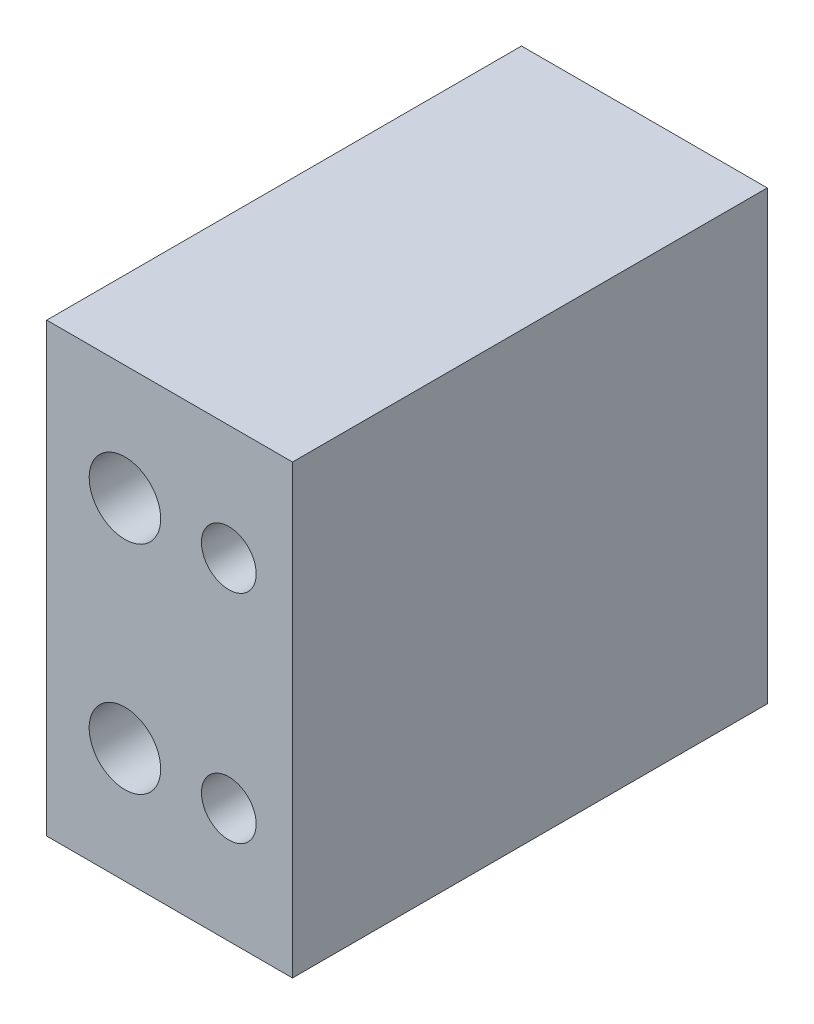
ISO-10303-21;
HEADER;
FILE_DESCRIPTION(('STEP AP214'),'2;1');
FILE_NAME('part.step','',(''),(''),'','','');
FILE_SCHEMA(('AUTOMOTIVE_DESIGN { 1 0 10303 214 1 1 1 1 }'));
ENDSEC;
DATA;
#1=APPLICATION_CONTEXT('core data for automotive mechanical design processes');
#2=APPLICATION_PROTOCOL_DEFINITION('international standard','automotive_design',2000,#1);
#3=PRODUCT_CONTEXT('',#1,'mechanical');
#4=PRODUCT('Part','Part','',(#3));
#5=PRODUCT_RELATED_PRODUCT_CATEGORY('part','',(#4));
#6=PRODUCT_DEFINITION_FORMATION('','',#4);
#7=PRODUCT_DEFINITION_CONTEXT('part definition',#1,'design');
#8=PRODUCT_DEFINITION('design','',#6,#7);
#9=PRODUCT_DEFINITION_SHAPE('','',#8);
#10=(LENGTH_UNIT() NAMED_UNIT(*) SI_UNIT(.MILLI.,.METRE.));
#11=(NAMED_UNIT(*) PLANE_ANGLE_UNIT() SI_UNIT($,.RADIAN.));
#12=(NAMED_UNIT(*) SI_UNIT($,.STERADIAN.) SOLID_ANGLE_UNIT());
#13=UNCERTAINTY_MEASURE_WITH_UNIT(LENGTH_MEASURE(1.E-05),#10,'distance_accuracy_value','');
#14=(GEOMETRIC_REPRESENTATION_CONTEXT(3) GLOBAL_UNCERTAINTY_ASSIGNED_CONTEXT((#13)) GLOBAL_UNIT_ASSIGNED_CONTEXT((#10,
#11,#12)) REPRESENTATION_CONTEXT('',''));
#15=CARTESIAN_POINT('',(0.,0.,0.));
#16=DIRECTION('',(0.,0.,1.));
#17=DIRECTION('',(1.,0.,0.));
#18=AXIS2_PLACEMENT_3D('',#15,#16,#17);
#19=CARTESIAN_POINT('',(3.50000000000072,5.14999999999954,21.25));
#20=DIRECTION('',(0.,0.,-1.));
#21=DIRECTION('',(-1.,0.,0.));
#22=AXIS2_PLACEMENT_3D('',#19,#20,#21);
#23=CYLINDRICAL_SURFACE('',#22,1.6);
#24=CARTESIAN_POINT('',(3.50000000000072,5.14999999999954,3.));
#25=DIRECTION('',(0.,0.,-1.));
#26=DIRECTION('',(0.,1.,0.));
#27=AXIS2_PLACEMENT_3D('',#24,#25,#26);
#28=CIRCLE('',#27,1.6);
#29=CARTESIAN_POINT('',(3.50000000000072,6.74999999999954,3.));
#30=VERTEX_POINT('',#29);
#31=EDGE_CURVE('E190',#30,#30,#28,.T.);
#32=ORIENTED_EDGE('',*,*,#31,.F.);
#33=EDGE_LOOP('',(#32));
#34=FACE_BOUND('',#33,.T.);
#35=CARTESIAN_POINT('',(3.50000000000072,5.14999999999954,0.));
#36=DIRECTION('',(0.,0.,1.));
#37=DIRECTION('',(1.,0.,0.));
#38=AXIS2_PLACEMENT_3D('',#35,#36,#37);
#39=CIRCLE('',#38,1.6);
#40=CARTESIAN_POINT('',(5.10000000000072,5.14999999999954,0.));
#41=VERTEX_POINT('',#40);
#42=EDGE_CURVE('E242',#41,#41,#39,.T.);
#43=ORIENTED_EDGE('',*,*,#42,.F.);
#44=EDGE_LOOP('',(#43));
#45=FACE_BOUND('',#44,.T.);
#46=ADVANCED_FACE('F35',(#34,#45),#23,.F.);
#47=CARTESIAN_POINT('',(8.15000000000055,5.14999999999954,21.25));
#48=DIRECTION('',(0.,0.,-1.));
#49=DIRECTION('',(-1.,0.,0.));
#50=AXIS2_PLACEMENT_3D('',#47,#48,#49);
#51=CYLINDRICAL_SURFACE('',#50,1.225);
#52=CARTESIAN_POINT('',(8.15000000000055,5.14999999999954,0.));
#53=DIRECTION('',(0.,0.,1.));
#54=DIRECTION('',(1.,0.,0.));
#55=AXIS2_PLACEMENT_3D('',#52,#53,#54);
#56=CIRCLE('',#55,1.225);
#57=CARTESIAN_POINT('',(9.37500000000055,5.14999999999954,0.));
#58=VERTEX_POINT('',#57);
#59=EDGE_CURVE('E232',#58,#58,#56,.T.);
#60=ORIENTED_EDGE('',*,*,#59,.F.);
#61=EDGE_LOOP('',(#60));
#62=FACE_BOUND('',#61,.T.);
#63=CARTESIAN_POINT('',(8.15000000000055,5.14999999999954,21.25));
#64=DIRECTION('',(0.,0.,1.));
#65=DIRECTION('',(1.,0.,0.));
#66=AXIS2_PLACEMENT_3D('',#63,#64,#65);
#67=CIRCLE('',#66,1.225);
#68=CARTESIAN_POINT('',(9.37500000000055,5.14999999999954,21.25));
#69=VERTEX_POINT('',#68);
#70=EDGE_CURVE('E233',#69,#69,#67,.T.);
#71=ORIENTED_EDGE('',*,*,#70,.T.);
#72=EDGE_LOOP('',(#71));
#73=FACE_BOUND('',#72,.T.);
#74=CARTESIAN_POINT('',(8.15000000000055,5.14999999999954,6.));
#75=DIRECTION('',(0.,0.,1.));
#76=DIRECTION('',(1.,0.,0.));
#77=AXIS2_PLACEMENT_3D('',#74,#75,#76);
#78=CIRCLE('',#77,1.225);
#79=CARTESIAN_POINT('',(7.10000000000026,5.78097147320526,6.));
#80=VERTEX_POINT('',#79);
#81=CARTESIAN_POINT('',(7.1000000000002,4.51902852679392,6.));
#82=VERTEX_POINT('',#81);
#83=EDGE_CURVE('E298',#80,#82,#78,.T.);
#84=ORIENTED_EDGE('',*,*,#83,.F.);
#85=DIRECTION('',(0.,0.,-1.));
#86=VECTOR('',#85,1.);
#87=CARTESIAN_POINT('',(7.10000000000026,5.78097147320526,21.25));
#88=LINE('',#87,#86);
#89=CARTESIAN_POINT('',(7.10000000000026,5.78097147320526,3.));
#90=VERTEX_POINT('',#89);
#91=EDGE_CURVE('E11',#80,#90,#88,.T.);
#92=ORIENTED_EDGE('',*,*,#91,.T.);
#93=CARTESIAN_POINT('',(8.15000000000055,5.14999999999954,3.));
#94=DIRECTION('',(0.,0.,-1.));
#95=DIRECTION('',(0.,1.,0.));
#96=AXIS2_PLACEMENT_3D('',#93,#94,#95);
#97=CIRCLE('',#96,1.225);
#98=CARTESIAN_POINT('',(7.1000000000002,4.51902852679392,3.));
#99=VERTEX_POINT('',#98);
#100=EDGE_CURVE('E43',#99,#90,#97,.T.);
#101=ORIENTED_EDGE('',*,*,#100,.F.);
#102=DIRECTION('',(0.,0.,-1.));
#103=VECTOR('',#102,1.);
#104=CARTESIAN_POINT('',(7.1000000000002,4.51902852679392,21.25));
#105=LINE('',#104,#103);
#106=EDGE_CURVE('E153',#99,#82,#105,.F.);
#107=ORIENTED_EDGE('',*,*,#106,.T.);
#108=EDGE_LOOP('',(#84,#92,#101,#107));
#109=FACE_BOUND('',#108,.T.);
#110=ADVANCED_FACE('F306',(#62,#73,#109),#51,.F.);
#111=CARTESIAN_POINT('',(3.50000000000028,14.8499999999991,21.25));
#112=DIRECTION('',(0.,0.,-1.));
#113=DIRECTION('',(-1.,0.,0.));
#114=AXIS2_PLACEMENT_3D('',#111,#112,#113);
#115=CYLINDRICAL_SURFACE('',#114,1.6);
#116=CARTESIAN_POINT('',(3.50000000000028,14.8499999999991,3.));
#117=DIRECTION('',(0.,0.,-1.));
#118=DIRECTION('',(0.,1.,0.));
#119=AXIS2_PLACEMENT_3D('',#116,#117,#118);
#120=CIRCLE('',#119,1.6);
#121=CARTESIAN_POINT('',(3.50000000000028,16.4499999999991,3.));
#122=VERTEX_POINT('',#121);
#123=EDGE_CURVE('E229',#122,#122,#120,.T.);
#124=ORIENTED_EDGE('',*,*,#123,.F.);
#125=EDGE_LOOP('',(#124));
#126=FACE_BOUND('',#125,.T.);
#127=CARTESIAN_POINT('',(3.50000000000028,14.8499999999991,0.));
#128=DIRECTION('',(0.,0.,1.));
#129=DIRECTION('',(1.,0.,0.));
#130=AXIS2_PLACEMENT_3D('',#127,#128,#129);
#131=CIRCLE('',#130,1.6);
#132=CARTESIAN_POINT('',(5.10000000000028,14.8499999999991,0.));
#133=VERTEX_POINT('',#132);
#134=EDGE_CURVE('E248',#133,#133,#131,.T.);
#135=ORIENTED_EDGE('',*,*,#134,.F.);
#136=EDGE_LOOP('',(#135));
#137=FACE_BOUND('',#136,.T.);
#138=ADVANCED_FACE('F359',(#126,#137),#115,.F.);
#139=CARTESIAN_POINT('',(8.1500000000001,14.85,21.25));
#140=DIRECTION('',(0.,0.,-1.));
#141=DIRECTION('',(-1.,0.,0.));
#142=AXIS2_PLACEMENT_3D('',#139,#140,#141);
#143=CYLINDRICAL_SURFACE('',#142,1.225);
#144=CARTESIAN_POINT('',(8.1500000000001,14.85,0.));
#145=DIRECTION('',(0.,0.,1.));
#146=DIRECTION('',(1.,0.,0.));
#147=AXIS2_PLACEMENT_3D('',#144,#145,#146);
#148=CIRCLE('',#147,1.225);
#149=CARTESIAN_POINT('',(9.3750000000001,14.85,0.));
#150=VERTEX_POINT('',#149);
#151=EDGE_CURVE('E236',#150,#150,#148,.T.);
#152=ORIENTED_EDGE('',*,*,#151,.F.);
#153=EDGE_LOOP('',(#152));
#154=FACE_BOUND('',#153,.T.);
#155=CARTESIAN_POINT('',(8.1500000000001,14.85,21.25));
#156=DIRECTION('',(0.,0.,1.));
#157=DIRECTION('',(1.,0.,0.));
#158=AXIS2_PLACEMENT_3D('',#155,#156,#157);
#159=CIRCLE('',#158,1.225);
#160=CARTESIAN_POINT('',(9.3750000000001,14.85,21.25));
#161=VERTEX_POINT('',#160);
#162=EDGE_CURVE('E239',#161,#161,#159,.T.);
#163=ORIENTED_EDGE('',*,*,#162,.T.);
#164=EDGE_LOOP('',(#163));
#165=FACE_BOUND('',#164,.T.);
#166=CARTESIAN_POINT('',(8.1500000000001,14.85,6.));
#167=DIRECTION('',(0.,0.,1.));
#168=DIRECTION('',(0.,-1.,0.));
#169=AXIS2_PLACEMENT_3D('',#166,#167,#168);
#170=CIRCLE('',#169,1.225);
#171=CARTESIAN_POINT('',(7.10000000000069,15.4809714732072,6.));
#172=VERTEX_POINT('',#171);
#173=CARTESIAN_POINT('',(7.10000000000063,14.219028526793,6.));
#174=VERTEX_POINT('',#173);
#175=EDGE_CURVE('E289',#172,#174,#170,.T.);
#176=ORIENTED_EDGE('',*,*,#175,.F.);
#177=DIRECTION('',(0.,0.,-1.));
#178=VECTOR('',#177,1.);
#179=CARTESIAN_POINT('',(7.10000000000068,15.4809714732072,21.25));
#180=LINE('',#179,#178);
#181=CARTESIAN_POINT('',(7.10000000000069,15.4809714732072,3.));
#182=VERTEX_POINT('',#181);
#183=EDGE_CURVE('E294',#172,#182,#180,.T.);
#184=ORIENTED_EDGE('',*,*,#183,.T.);
#185=CARTESIAN_POINT('',(8.1500000000001,14.85,3.));
#186=DIRECTION('',(0.,0.,-1.));
#187=DIRECTION('',(0.,1.,0.));
#188=AXIS2_PLACEMENT_3D('',#185,#186,#187);
#189=CIRCLE('',#188,1.225);
#190=CARTESIAN_POINT('',(7.10000000000063,14.219028526793,3.));
#191=VERTEX_POINT('',#190);
#192=EDGE_CURVE('E292',#191,#182,#189,.T.);
#193=ORIENTED_EDGE('',*,*,#192,.F.);
#194=DIRECTION('',(0.,0.,-1.));
#195=VECTOR('',#194,1.);
#196=CARTESIAN_POINT('',(7.10000000000063,14.219028526793,21.25));
#197=LINE('',#196,#195);
#198=EDGE_CURVE('E286',#191,#174,#197,.F.);
#199=ORIENTED_EDGE('',*,*,#198,.T.);
#200=EDGE_LOOP('',(#176,#184,#193,#199));
#201=FACE_BOUND('',#200,.T.);
#202=ADVANCED_FACE('F384',(#154,#165,#201),#143,.F.);
#203=CARTESIAN_POINT('',(0.,0.,21.25));
#204=DIRECTION('',(0.,0.,1.));
#205=DIRECTION('',(1.,0.,0.));
#206=AXIS2_PLACEMENT_3D('',#203,#204,#205);
#207=PLANE('',#206);
#208=ORIENTED_EDGE('',*,*,#162,.F.);
#209=EDGE_LOOP('',(#208));
#210=FACE_BOUND('',#209,.T.);
#211=CARTESIAN_POINT('',(3.50000000000028,14.8499999999991,21.25));
#212=DIRECTION('',(0.,0.,1.));
#213=DIRECTION('',(1.,0.,0.));
#214=AXIS2_PLACEMENT_3D('',#211,#212,#213);
#215=CIRCLE('',#214,1.6);
#216=CARTESIAN_POINT('',(5.10000000000028,14.8499999999991,21.25));
#217=VERTEX_POINT('',#216);
#218=EDGE_CURVE('E251',#217,#217,#215,.T.);
#219=ORIENTED_EDGE('',*,*,#218,.F.);
#220=EDGE_LOOP('',(#219));
#221=FACE_BOUND('',#220,.T.);
#222=DIRECTION('',(0.,-1.,0.));
#223=VECTOR('',#222,1.);
#224=CARTESIAN_POINT('',(8.88178419700125E-13,19.9999999999996,21.25));
#225=LINE('',#224,#223);
#226=CARTESIAN_POINT('',(8.88178419700125E-13,19.9999999999996,21.25));
#227=VERTEX_POINT('',#226);
#228=CARTESIAN_POINT('',(0.,0.,21.25));
#229=VERTEX_POINT('',#228);
#230=EDGE_CURVE('E257',#227,#229,#225,.T.);
#231=ORIENTED_EDGE('',*,*,#230,.T.);
#232=DIRECTION('',(1.,0.,0.));
#233=VECTOR('',#232,1.);
#234=CARTESIAN_POINT('',(0.,0.,21.25));
#235=LINE('',#234,#233);
#236=CARTESIAN_POINT('',(11.000000000001,0.,21.25));
#237=VERTEX_POINT('',#236);
#238=EDGE_CURVE('E260',#229,#237,#235,.T.);
#239=ORIENTED_EDGE('',*,*,#238,.T.);
#240=DIRECTION('',(0.,1.,0.));
#241=VECTOR('',#240,1.);
#242=CARTESIAN_POINT('',(11.000000000001,19.9999999999996,21.25));
#243=LINE('',#242,#241);
#244=CARTESIAN_POINT('',(11.000000000001,19.9999999999996,21.25));
#245=VERTEX_POINT('',#244);
#246=EDGE_CURVE('E263',#237,#245,#243,.T.);
#247=ORIENTED_EDGE('',*,*,#246,.T.);
#248=DIRECTION('',(-1.,0.,0.));
#249=VECTOR('',#248,1.);
#250=CARTESIAN_POINT('',(8.88178419700125E-13,19.9999999999996,21.25));
#251=LINE('',#250,#249);
#252=EDGE_CURVE('E265',#245,#227,#251,.T.);
#253=ORIENTED_EDGE('',*,*,#252,.T.);
#254=EDGE_LOOP('',(#231,#239,#247,#253));
#255=FACE_BOUND('',#254,.T.);
#256=CARTESIAN_POINT('',(3.50000000000072,5.14999999999954,21.25));
#257=DIRECTION('',(0.,0.,1.));
#258=DIRECTION('',(1.,0.,0.));
#259=AXIS2_PLACEMENT_3D('',#256,#257,#258);
#260=CIRCLE('',#259,1.6);
#261=CARTESIAN_POINT('',(5.10000000000072,5.14999999999954,21.25));
#262=VERTEX_POINT('',#261);
#263=EDGE_CURVE('E245',#262,#262,#260,.T.);
#264=ORIENTED_EDGE('',*,*,#263,.F.);
#265=EDGE_LOOP('',(#264));
#266=FACE_BOUND('',#265,.T.);
#267=ORIENTED_EDGE('',*,*,#70,.F.);
#268=EDGE_LOOP('',(#267));
#269=FACE_BOUND('',#268,.T.);
#270=ADVANCED_FACE('F335',(#210,#221,#255,#266,#269),#207,.T.);
#271=CARTESIAN_POINT('',(0.,0.,0.));
#272=DIRECTION('',(0.,0.,1.));
#273=DIRECTION('',(1.,0.,0.));
#274=AXIS2_PLACEMENT_3D('',#271,#272,#273);
#275=PLANE('',#274);
#276=ORIENTED_EDGE('',*,*,#151,.T.);
#277=EDGE_LOOP('',(#276));
#278=FACE_BOUND('',#277,.T.);
#279=ORIENTED_EDGE('',*,*,#134,.T.);
#280=EDGE_LOOP('',(#279));
#281=FACE_BOUND('',#280,.T.);
#282=DIRECTION('',(0.,-1.,0.));
#283=VECTOR('',#282,1.);
#284=CARTESIAN_POINT('',(8.88178419700125E-13,19.9999999999996,0.));
#285=LINE('',#284,#283);
#286=CARTESIAN_POINT('',(8.88178419700125E-13,19.9999999999996,0.));
#287=VERTEX_POINT('',#286);
#288=CARTESIAN_POINT('',(0.,0.,0.));
#289=VERTEX_POINT('',#288);
#290=EDGE_CURVE('E254',#287,#289,#285,.T.);
#291=ORIENTED_EDGE('',*,*,#290,.F.);
#292=DIRECTION('',(-1.,0.,0.));
#293=VECTOR('',#292,1.);
#294=CARTESIAN_POINT('',(8.88178419700125E-13,19.9999999999996,0.));
#295=LINE('',#294,#293);
#296=CARTESIAN_POINT('',(11.000000000001,19.9999999999996,0.));
#297=VERTEX_POINT('',#296);
#298=EDGE_CURVE('E261',#297,#287,#295,.T.);
#299=ORIENTED_EDGE('',*,*,#298,.F.);
#300=DIRECTION('',(0.,1.,0.));
#301=VECTOR('',#300,1.);
#302=CARTESIAN_POINT('',(11.000000000001,19.9999999999996,0.));
#303=LINE('',#302,#301);
#304=CARTESIAN_POINT('',(11.000000000001,0.,0.));
#305=VERTEX_POINT('',#304);
#306=EDGE_CURVE('E272',#305,#297,#303,.T.);
#307=ORIENTED_EDGE('',*,*,#306,.F.);
#308=DIRECTION('',(1.,0.,0.));
#309=VECTOR('',#308,1.);
#310=CARTESIAN_POINT('',(0.,0.,0.));
#311=LINE('',#310,#309);
#312=EDGE_CURVE('E270',#289,#305,#311,.T.);
#313=ORIENTED_EDGE('',*,*,#312,.F.);
#314=EDGE_LOOP('',(#291,#299,#307,#313));
#315=FACE_BOUND('',#314,.T.);
#316=ORIENTED_EDGE('',*,*,#42,.T.);
#317=EDGE_LOOP('',(#316));
#318=FACE_BOUND('',#317,.T.);
#319=ORIENTED_EDGE('',*,*,#59,.T.);
#320=EDGE_LOOP('',(#319));
#321=FACE_BOUND('',#320,.T.);
#322=ADVANCED_FACE('F318',(#278,#281,#315,#318,#321),#275,.F.);
#323=CARTESIAN_POINT('',(8.88178419700125E-13,19.9999999999996,21.25));
#324=DIRECTION('',(1.,0.,0.));
#325=DIRECTION('',(0.,1.,0.));
#326=AXIS2_PLACEMENT_3D('',#323,#324,#325);
#327=PLANE('',#326);
#328=DIRECTION('',(0.,0.,1.));
#329=VECTOR('',#328,1.);
#330=CARTESIAN_POINT('',(1.01858849501713E-13,2.3,3.));
#331=LINE('',#330,#329);
#332=CARTESIAN_POINT('',(1.04308143100007E-13,2.3,3.));
#333=VERTEX_POINT('',#332);
#334=CARTESIAN_POINT('',(1.01858849501713E-13,2.3,6.));
#335=VERTEX_POINT('',#334);
#336=EDGE_CURVE('E175',#333,#335,#331,.T.);
#337=ORIENTED_EDGE('',*,*,#336,.F.);
#338=DIRECTION('',(0.,-1.,0.));
#339=VECTOR('',#338,1.);
#340=CARTESIAN_POINT('',(3.5429165044074E-13,8.,3.));
#341=LINE('',#340,#339);
#342=CARTESIAN_POINT('',(3.5429165044074E-13,8.,3.));
#343=VERTEX_POINT('',#342);
#344=EDGE_CURVE('E50',#343,#333,#341,.T.);
#345=ORIENTED_EDGE('',*,*,#344,.F.);
#346=DIRECTION('',(0.,0.,-1.));
#347=VECTOR('',#346,1.);
#348=CARTESIAN_POINT('',(3.5429165044074E-13,8.,3.));
#349=LINE('',#348,#347);
#350=CARTESIAN_POINT('',(3.5429165044074E-13,8.,6.));
#351=VERTEX_POINT('',#350);
#352=EDGE_CURVE('E156',#351,#343,#349,.T.);
#353=ORIENTED_EDGE('',*,*,#352,.F.);
#354=DIRECTION('',(0.,1.,0.));
#355=VECTOR('',#354,1.);
#356=CARTESIAN_POINT('',(3.5429165044074E-13,8.,6.));
#357=LINE('',#356,#355);
#358=EDGE_CURVE('E177',#335,#351,#357,.T.);
#359=ORIENTED_EDGE('',*,*,#358,.F.);
#360=EDGE_LOOP('',(#337,#345,#353,#359));
#361=FACE_BOUND('',#360,.T.);
#362=DIRECTION('',(0.,0.,1.));
#363=VECTOR('',#362,1.);
#364=CARTESIAN_POINT('',(5.31437475661091E-13,11.9999999999996,3.));
#365=LINE('',#364,#363);
#366=CARTESIAN_POINT('',(5.33886769259386E-13,11.9999999999996,3.));
#367=VERTEX_POINT('',#366);
#368=CARTESIAN_POINT('',(5.31437475661091E-13,11.9999999999996,6.));
#369=VERTEX_POINT('',#368);
#370=EDGE_CURVE('E209',#367,#369,#365,.T.);
#371=ORIENTED_EDGE('',*,*,#370,.F.);
#372=DIRECTION('',(0.,-1.,0.));
#373=VECTOR('',#372,1.);
#374=CARTESIAN_POINT('',(7.83870276600118E-13,17.6999999999996,3.));
#375=LINE('',#374,#373);
#376=CARTESIAN_POINT('',(7.83870276600118E-13,17.6999999999996,3.));
#377=VERTEX_POINT('',#376);
#378=EDGE_CURVE('E193',#377,#367,#375,.T.);
#379=ORIENTED_EDGE('',*,*,#378,.F.);
#380=DIRECTION('',(0.,0.,-1.));
#381=VECTOR('',#380,1.);
#382=CARTESIAN_POINT('',(7.83870276600118E-13,17.6999999999996,3.));
#383=LINE('',#382,#381);
#384=CARTESIAN_POINT('',(7.83870276600118E-13,17.6999999999996,6.));
#385=VERTEX_POINT('',#384);
#386=EDGE_CURVE('E215',#385,#377,#383,.T.);
#387=ORIENTED_EDGE('',*,*,#386,.F.);
#388=DIRECTION('',(0.,1.,0.));
#389=VECTOR('',#388,1.);
#390=CARTESIAN_POINT('',(7.83870276600118E-13,17.6999999999996,6.));
#391=LINE('',#390,#389);
#392=EDGE_CURVE('E212',#369,#385,#391,.T.);
#393=ORIENTED_EDGE('',*,*,#392,.F.);
#394=EDGE_LOOP('',(#371,#379,#387,#393));
#395=FACE_BOUND('',#394,.T.);
#396=ORIENTED_EDGE('',*,*,#290,.T.);
#397=DIRECTION('',(0.,0.,-1.));
#398=VECTOR('',#397,1.);
#399=CARTESIAN_POINT('',(0.,0.,21.25));
#400=LINE('',#399,#398);
#401=EDGE_CURVE('E283',#229,#289,#400,.T.);
#402=ORIENTED_EDGE('',*,*,#401,.F.);
#403=ORIENTED_EDGE('',*,*,#230,.F.);
#404=DIRECTION('',(0.,0.,-1.));
#405=VECTOR('',#404,1.);
#406=CARTESIAN_POINT('',(8.88178419700125E-13,19.9999999999996,21.25));
#407=LINE('',#406,#405);
#408=EDGE_CURVE('E267',#227,#287,#407,.T.);
#409=ORIENTED_EDGE('',*,*,#408,.T.);
#410=EDGE_LOOP('',(#396,#402,#403,#409));
#411=FACE_BOUND('',#410,.T.);
#412=ADVANCED_FACE('F37',(#361,#395,#411),#327,.F.);
#413=CARTESIAN_POINT('',(0.,0.,21.25));
#414=DIRECTION('',(0.,1.,0.));
#415=DIRECTION('',(0.,0.,1.));
#416=AXIS2_PLACEMENT_3D('',#413,#414,#415);
#417=PLANE('',#416);
#418=ORIENTED_EDGE('',*,*,#312,.T.);
#419=DIRECTION('',(0.,0.,-1.));
#420=VECTOR('',#419,1.);
#421=CARTESIAN_POINT('',(11.000000000001,0.,21.25));
#422=LINE('',#421,#420);
#423=EDGE_CURVE('E280',#237,#305,#422,.T.);
#424=ORIENTED_EDGE('',*,*,#423,.F.);
#425=ORIENTED_EDGE('',*,*,#238,.F.);
#426=ORIENTED_EDGE('',*,*,#401,.T.);
#427=EDGE_LOOP('',(#418,#424,#425,#426));
#428=FACE_BOUND('',#427,.T.);
#429=ADVANCED_FACE('F317',(#428),#417,.F.);
#430=CARTESIAN_POINT('',(11.000000000001,19.9999999999996,21.25));
#431=DIRECTION('',(-1.,0.,0.));
#432=DIRECTION('',(0.,0.,1.));
#433=AXIS2_PLACEMENT_3D('',#430,#431,#432);
#434=PLANE('',#433);
#435=ORIENTED_EDGE('',*,*,#306,.T.);
#436=DIRECTION('',(0.,0.,-1.));
#437=VECTOR('',#436,1.);
#438=CARTESIAN_POINT('',(11.000000000001,19.9999999999996,21.25));
#439=LINE('',#438,#437);
#440=EDGE_CURVE('E277',#245,#297,#439,.T.);
#441=ORIENTED_EDGE('',*,*,#440,.F.);
#442=ORIENTED_EDGE('',*,*,#246,.F.);
#443=ORIENTED_EDGE('',*,*,#423,.T.);
#444=EDGE_LOOP('',(#435,#441,#442,#443));
#445=FACE_BOUND('',#444,.T.);
#446=ADVANCED_FACE('F342',(#445),#434,.F.);
#447=CARTESIAN_POINT('',(8.88178419700125E-13,19.9999999999996,21.25));
#448=DIRECTION('',(0.,-1.,0.));
#449=DIRECTION('',(0.,0.,-1.));
#450=AXIS2_PLACEMENT_3D('',#447,#448,#449);
#451=PLANE('',#450);
#452=ORIENTED_EDGE('',*,*,#298,.T.);
#453=ORIENTED_EDGE('',*,*,#408,.F.);
#454=ORIENTED_EDGE('',*,*,#252,.F.);
#455=ORIENTED_EDGE('',*,*,#440,.T.);
#456=EDGE_LOOP('',(#452,#453,#454,#455));
#457=FACE_BOUND('',#456,.T.);
#458=ADVANCED_FACE('F340',(#457),#451,.F.);
#459=CARTESIAN_POINT('',(3.50000000000028,14.8499999999991,6.));
#460=DIRECTION('',(0.,0.,1.));
#461=DIRECTION('',(0.,-1.,0.));
#462=AXIS2_PLACEMENT_3D('',#459,#460,#461);
#463=CIRCLE('',#462,1.6);
#464=CARTESIAN_POINT('',(3.50000000000028,13.2499999999991,6.));
#465=VERTEX_POINT('',#464);
#466=EDGE_CURVE('E220',#465,#465,#463,.T.);
#467=ORIENTED_EDGE('',*,*,#466,.F.);
#468=EDGE_LOOP('',(#467));
#469=FACE_BOUND('',#468,.T.);
#470=ORIENTED_EDGE('',*,*,#218,.T.);
#471=EDGE_LOOP('',(#470));
#472=FACE_BOUND('',#471,.T.);
#473=ADVANCED_FACE('F349',(#469,#472),#115,.F.);
#474=CARTESIAN_POINT('',(3.50000000000072,5.14999999999954,6.));
#475=DIRECTION('',(0.,0.,1.));
#476=DIRECTION('',(1.,0.,0.));
#477=AXIS2_PLACEMENT_3D('',#474,#475,#476);
#478=CIRCLE('',#477,1.6);
#479=CARTESIAN_POINT('',(5.10000000000072,5.14999999999954,6.));
#480=VERTEX_POINT('',#479);
#481=EDGE_CURVE('E184',#480,#480,#478,.T.);
#482=ORIENTED_EDGE('',*,*,#481,.F.);
#483=EDGE_LOOP('',(#482));
#484=FACE_BOUND('',#483,.T.);
#485=ORIENTED_EDGE('',*,*,#263,.T.);
#486=EDGE_LOOP('',(#485));
#487=FACE_BOUND('',#486,.T.);
#488=ADVANCED_FACE('F354',(#484,#487),#23,.F.);
#489=CARTESIAN_POINT('',(7.1,-3.14433839766157E-13,0.));
#490=DIRECTION('',(-1.,0.,0.));
#491=DIRECTION('',(0.,-1.,0.));
#492=AXIS2_PLACEMENT_3D('',#489,#490,#491);
#493=PLANE('',#492);
#494=DIRECTION('',(0.,1.,0.));
#495=VECTOR('',#494,1.);
#496=CARTESIAN_POINT('',(7.10000000000078,17.6999999999993,6.));
#497=LINE('',#496,#495);
#498=CARTESIAN_POINT('',(7.10000000000078,17.6999999999993,6.));
#499=VERTEX_POINT('',#498);
#500=EDGE_CURVE('E201',#172,#499,#497,.T.);
#501=ORIENTED_EDGE('',*,*,#500,.T.);
#502=DIRECTION('',(0.,0.,-1.));
#503=VECTOR('',#502,1.);
#504=CARTESIAN_POINT('',(7.10000000000078,17.6999999999993,3.));
#505=LINE('',#504,#503);
#506=CARTESIAN_POINT('',(7.10000000000078,17.6999999999993,3.));
#507=VERTEX_POINT('',#506);
#508=EDGE_CURVE('E204',#499,#507,#505,.T.);
#509=ORIENTED_EDGE('',*,*,#508,.T.);
#510=DIRECTION('',(0.,-1.,0.));
#511=VECTOR('',#510,1.);
#512=CARTESIAN_POINT('',(7.10000000000078,17.6999999999993,3.));
#513=LINE('',#512,#511);
#514=EDGE_CURVE('E194',#507,#182,#513,.T.);
#515=ORIENTED_EDGE('',*,*,#514,.T.);
#516=ORIENTED_EDGE('',*,*,#183,.F.);
#517=EDGE_LOOP('',(#501,#509,#515,#516));
#518=FACE_BOUND('',#517,.T.);
#519=ADVANCED_FACE('F367',(#518),#493,.T.);
#520=CARTESIAN_POINT('',(7.10000000000078,17.6999999999993,3.));
#521=DIRECTION('',(0.,0.,-1.));
#522=DIRECTION('',(0.,1.,0.));
#523=AXIS2_PLACEMENT_3D('',#520,#521,#522);
#524=PLANE('',#523);
#525=ORIENTED_EDGE('',*,*,#123,.T.);
#526=EDGE_LOOP('',(#525));
#527=FACE_BOUND('',#526,.T.);
#528=ORIENTED_EDGE('',*,*,#192,.T.);
#529=ORIENTED_EDGE('',*,*,#514,.F.);
#530=DIRECTION('',(-1.,0.,0.));
#531=VECTOR('',#530,1.);
#532=CARTESIAN_POINT('',(7.10000000000078,17.6999999999993,3.));
#533=LINE('',#532,#531);
#534=EDGE_CURVE('E218',#507,#377,#533,.T.);
#535=ORIENTED_EDGE('',*,*,#534,.T.);
#536=ORIENTED_EDGE('',*,*,#378,.T.);
#537=DIRECTION('',(-1.,0.,0.));
#538=VECTOR('',#537,1.);
#539=CARTESIAN_POINT('',(7.10000000000053,11.9999999999993,3.));
#540=LINE('',#539,#538);
#541=CARTESIAN_POINT('',(7.10000000000053,11.9999999999993,3.));
#542=VERTEX_POINT('',#541);
#543=EDGE_CURVE('E207',#542,#367,#540,.T.);
#544=ORIENTED_EDGE('',*,*,#543,.F.);
#545=EDGE_CURVE('E198',#191,#542,#513,.T.);
#546=ORIENTED_EDGE('',*,*,#545,.F.);
#547=EDGE_LOOP('',(#528,#529,#535,#536,#544,#546));
#548=FACE_BOUND('',#547,.T.);
#549=ADVANCED_FACE('F374',(#527,#548),#524,.F.);
#550=CARTESIAN_POINT('',(7.10000000000078,17.6999999999993,3.));
#551=DIRECTION('',(0.,1.,0.));
#552=DIRECTION('',(-1.,0.,0.));
#553=AXIS2_PLACEMENT_3D('',#550,#551,#552);
#554=PLANE('',#553);
#555=ORIENTED_EDGE('',*,*,#386,.T.);
#556=ORIENTED_EDGE('',*,*,#534,.F.);
#557=ORIENTED_EDGE('',*,*,#508,.F.);
#558=DIRECTION('',(-1.,0.,0.));
#559=VECTOR('',#558,1.);
#560=CARTESIAN_POINT('',(7.10000000000078,17.6999999999993,6.));
#561=LINE('',#560,#559);
#562=EDGE_CURVE('E221',#499,#385,#561,.T.);
#563=ORIENTED_EDGE('',*,*,#562,.T.);
#564=EDGE_LOOP('',(#555,#556,#557,#563));
#565=FACE_BOUND('',#564,.T.);
#566=ADVANCED_FACE('F420',(#565),#554,.F.);
#567=CARTESIAN_POINT('',(7.10000000000078,17.6999999999993,6.));
#568=DIRECTION('',(0.,0.,1.));
#569=DIRECTION('',(0.,-1.,0.));
#570=AXIS2_PLACEMENT_3D('',#567,#568,#569);
#571=PLANE('',#570);
#572=ORIENTED_EDGE('',*,*,#466,.T.);
#573=EDGE_LOOP('',(#572));
#574=FACE_BOUND('',#573,.T.);
#575=ORIENTED_EDGE('',*,*,#175,.T.);
#576=CARTESIAN_POINT('',(7.10000000000053,11.9999999999993,6.));
#577=VERTEX_POINT('',#576);
#578=EDGE_CURVE('E202',#577,#174,#497,.T.);
#579=ORIENTED_EDGE('',*,*,#578,.F.);
#580=DIRECTION('',(-1.,0.,0.));
#581=VECTOR('',#580,1.);
#582=CARTESIAN_POINT('',(7.10000000000053,11.9999999999993,6.));
#583=LINE('',#582,#581);
#584=EDGE_CURVE('E223',#577,#369,#583,.T.);
#585=ORIENTED_EDGE('',*,*,#584,.T.);
#586=ORIENTED_EDGE('',*,*,#392,.T.);
#587=ORIENTED_EDGE('',*,*,#562,.F.);
#588=ORIENTED_EDGE('',*,*,#500,.F.);
#589=EDGE_LOOP('',(#575,#579,#585,#586,#587,#588));
#590=FACE_BOUND('',#589,.T.);
#591=ADVANCED_FACE('F407',(#574,#590),#571,.F.);
#592=CARTESIAN_POINT('',(7.10000000000053,11.9999999999993,3.));
#593=DIRECTION('',(0.,-1.,0.));
#594=DIRECTION('',(1.,0.,0.));
#595=AXIS2_PLACEMENT_3D('',#592,#593,#594);
#596=PLANE('',#595);
#597=ORIENTED_EDGE('',*,*,#370,.T.);
#598=ORIENTED_EDGE('',*,*,#584,.F.);
#599=DIRECTION('',(0.,0.,1.));
#600=VECTOR('',#599,1.);
#601=CARTESIAN_POINT('',(7.10000000000053,11.9999999999993,3.));
#602=LINE('',#601,#600);
#603=EDGE_CURVE('E197',#542,#577,#602,.T.);
#604=ORIENTED_EDGE('',*,*,#603,.F.);
#605=ORIENTED_EDGE('',*,*,#543,.T.);
#606=EDGE_LOOP('',(#597,#598,#604,#605));
#607=FACE_BOUND('',#606,.T.);
#608=ADVANCED_FACE('F417',(#607),#596,.F.);
#609=ORIENTED_EDGE('',*,*,#545,.T.);
#610=ORIENTED_EDGE('',*,*,#603,.T.);
#611=ORIENTED_EDGE('',*,*,#578,.T.);
#612=ORIENTED_EDGE('',*,*,#198,.F.);
#613=EDGE_LOOP('',(#609,#610,#611,#612));
#614=FACE_BOUND('',#613,.T.);
#615=ADVANCED_FACE('F377',(#614),#493,.T.);
#616=CARTESIAN_POINT('',(7.1,-3.14433839766157E-13,0.));
#617=DIRECTION('',(-1.,0.,0.));
#618=DIRECTION('',(0.,-1.,0.));
#619=AXIS2_PLACEMENT_3D('',#616,#617,#618);
#620=PLANE('',#619);
#621=DIRECTION('',(0.,1.,0.));
#622=VECTOR('',#621,1.);
#623=CARTESIAN_POINT('',(7.10000000000035,7.99999999999969,6.));
#624=LINE('',#623,#622);
#625=CARTESIAN_POINT('',(7.10000000000035,7.99999999999969,6.));
#626=VERTEX_POINT('',#625);
#627=EDGE_CURVE('E167',#80,#626,#624,.T.);
#628=ORIENTED_EDGE('',*,*,#627,.T.);
#629=DIRECTION('',(0.,0.,-1.));
#630=VECTOR('',#629,1.);
#631=CARTESIAN_POINT('',(7.10000000000035,7.99999999999969,3.));
#632=LINE('',#631,#630);
#633=CARTESIAN_POINT('',(7.10000000000035,7.99999999999969,3.));
#634=VERTEX_POINT('',#633);
#635=EDGE_CURVE('E164',#626,#634,#632,.T.);
#636=ORIENTED_EDGE('',*,*,#635,.T.);
#637=DIRECTION('',(0.,-1.,0.));
#638=VECTOR('',#637,1.);
#639=CARTESIAN_POINT('',(7.10000000000035,7.99999999999969,3.));
#640=LINE('',#639,#638);
#641=EDGE_CURVE('E155',#634,#90,#640,.T.);
#642=ORIENTED_EDGE('',*,*,#641,.T.);
#643=ORIENTED_EDGE('',*,*,#91,.F.);
#644=EDGE_LOOP('',(#628,#636,#642,#643));
#645=FACE_BOUND('',#644,.T.);
#646=ADVANCED_FACE('F302',(#645),#620,.T.);
#647=CARTESIAN_POINT('',(7.10000000000035,7.99999999999969,3.));
#648=DIRECTION('',(0.,0.,-1.));
#649=DIRECTION('',(0.,1.,0.));
#650=AXIS2_PLACEMENT_3D('',#647,#648,#649);
#651=PLANE('',#650);
#652=ORIENTED_EDGE('',*,*,#31,.T.);
#653=EDGE_LOOP('',(#652));
#654=FACE_BOUND('',#653,.T.);
#655=ORIENTED_EDGE('',*,*,#100,.T.);
#656=ORIENTED_EDGE('',*,*,#641,.F.);
#657=DIRECTION('',(-1.,0.,0.));
#658=VECTOR('',#657,1.);
#659=CARTESIAN_POINT('',(7.10000000000035,7.99999999999969,3.));
#660=LINE('',#659,#658);
#661=EDGE_CURVE('E182',#634,#343,#660,.T.);
#662=ORIENTED_EDGE('',*,*,#661,.T.);
#663=ORIENTED_EDGE('',*,*,#344,.T.);
#664=DIRECTION('',(-1.,0.,0.));
#665=VECTOR('',#664,1.);
#666=CARTESIAN_POINT('',(7.1000000000001,2.29999999999969,3.));
#667=LINE('',#666,#665);
#668=CARTESIAN_POINT('',(7.1000000000001,2.29999999999969,3.));
#669=VERTEX_POINT('',#668);
#670=EDGE_CURVE('E158',#669,#333,#667,.T.);
#671=ORIENTED_EDGE('',*,*,#670,.F.);
#672=EDGE_CURVE('E148',#99,#669,#640,.T.);
#673=ORIENTED_EDGE('',*,*,#672,.F.);
#674=EDGE_LOOP('',(#655,#656,#662,#663,#671,#673));
#675=FACE_BOUND('',#674,.T.);
#676=ADVANCED_FACE('F159',(#654,#675),#651,.F.);
#677=CARTESIAN_POINT('',(7.10000000000035,7.99999999999969,3.));
#678=DIRECTION('',(0.,1.,0.));
#679=DIRECTION('',(-1.,0.,0.));
#680=AXIS2_PLACEMENT_3D('',#677,#678,#679);
#681=PLANE('',#680);
#682=ORIENTED_EDGE('',*,*,#352,.T.);
#683=ORIENTED_EDGE('',*,*,#661,.F.);
#684=ORIENTED_EDGE('',*,*,#635,.F.);
#685=DIRECTION('',(-1.,0.,0.));
#686=VECTOR('',#685,1.);
#687=CARTESIAN_POINT('',(7.10000000000035,7.99999999999969,6.));
#688=LINE('',#687,#686);
#689=EDGE_CURVE('E185',#626,#351,#688,.T.);
#690=ORIENTED_EDGE('',*,*,#689,.T.);
#691=EDGE_LOOP('',(#682,#683,#684,#690));
#692=FACE_BOUND('',#691,.T.);
#693=ADVANCED_FACE('F313',(#692),#681,.F.);
#694=CARTESIAN_POINT('',(7.10000000000035,7.99999999999969,6.));
#695=DIRECTION('',(0.,0.,1.));
#696=DIRECTION('',(1.,0.,0.));
#697=AXIS2_PLACEMENT_3D('',#694,#695,#696);
#698=PLANE('',#697);
#699=ORIENTED_EDGE('',*,*,#481,.T.);
#700=EDGE_LOOP('',(#699));
#701=FACE_BOUND('',#700,.T.);
#702=ORIENTED_EDGE('',*,*,#83,.T.);
#703=CARTESIAN_POINT('',(7.1000000000001,2.29999999999969,6.));
#704=VERTEX_POINT('',#703);
#705=EDGE_CURVE('E58',#704,#82,#624,.T.);
#706=ORIENTED_EDGE('',*,*,#705,.F.);
#707=DIRECTION('',(-1.,0.,0.));
#708=VECTOR('',#707,1.);
#709=CARTESIAN_POINT('',(7.1000000000001,2.29999999999969,6.));
#710=LINE('',#709,#708);
#711=EDGE_CURVE('E163',#704,#335,#710,.T.);
#712=ORIENTED_EDGE('',*,*,#711,.T.);
#713=ORIENTED_EDGE('',*,*,#358,.T.);
#714=ORIENTED_EDGE('',*,*,#689,.F.);
#715=ORIENTED_EDGE('',*,*,#627,.F.);
#716=EDGE_LOOP('',(#702,#706,#712,#713,#714,#715));
#717=FACE_BOUND('',#716,.T.);
#718=ADVANCED_FACE('F308',(#701,#717),#698,.F.);
#719=CARTESIAN_POINT('',(7.1000000000001,2.29999999999969,3.));
#720=DIRECTION('',(0.,-1.,0.));
#721=DIRECTION('',(1.,0.,0.));
#722=AXIS2_PLACEMENT_3D('',#719,#720,#721);
#723=PLANE('',#722);
#724=ORIENTED_EDGE('',*,*,#336,.T.);
#725=ORIENTED_EDGE('',*,*,#711,.F.);
#726=DIRECTION('',(0.,0.,1.));
#727=VECTOR('',#726,1.);
#728=CARTESIAN_POINT('',(7.1000000000001,2.29999999999969,3.));
#729=LINE('',#728,#727);
#730=EDGE_CURVE('E151',#669,#704,#729,.T.);
#731=ORIENTED_EDGE('',*,*,#730,.F.);
#732=ORIENTED_EDGE('',*,*,#670,.T.);
#733=EDGE_LOOP('',(#724,#725,#731,#732));
#734=FACE_BOUND('',#733,.T.);
#735=ADVANCED_FACE('F166',(#734),#723,.F.);
#736=ORIENTED_EDGE('',*,*,#672,.T.);
#737=ORIENTED_EDGE('',*,*,#730,.T.);
#738=ORIENTED_EDGE('',*,*,#705,.T.);
#739=ORIENTED_EDGE('',*,*,#106,.F.);
#740=EDGE_LOOP('',(#736,#737,#738,#739));
#741=FACE_BOUND('',#740,.T.);
#742=ADVANCED_FACE('F149',(#741),#620,.T.);
#743=CLOSED_SHELL('',(#46,#110,#138,#202,#270,#322,#412,#429,#446,#458,#473,#488,#519,#549,#566,
#591,#608,#615,#646,#676,#693,#718,#735,#742));
#744=MANIFOLD_SOLID_BREP('B2',#743);
#745=ADVANCED_BREP_SHAPE_REPRESENTATION('',(#18,#744),#14);
#746=SHAPE_DEFINITION_REPRESENTATION(#9,#745);
ENDSEC;
END-ISO-10303-21;
